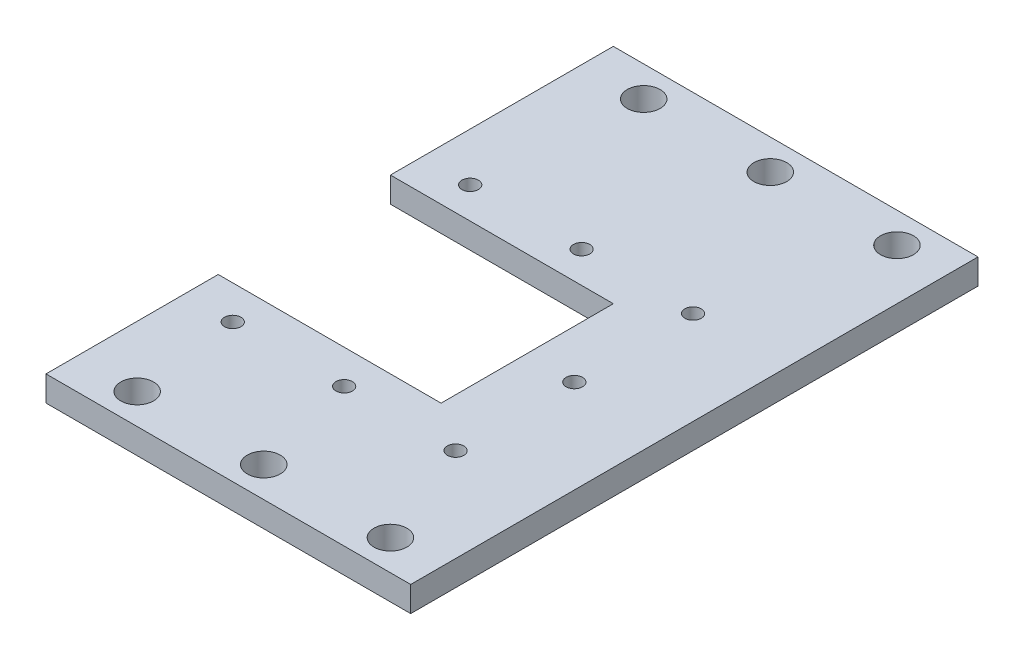
ISO-10303-21;
HEADER;
FILE_DESCRIPTION(('STEP AP214'),'2;1');
FILE_NAME('part.step','',(''),(''),'','','');
FILE_SCHEMA(('AUTOMOTIVE_DESIGN { 1 0 10303 214 1 1 1 1 }'));
ENDSEC;
DATA;
#1=APPLICATION_CONTEXT('core data for automotive mechanical design processes');
#2=APPLICATION_PROTOCOL_DEFINITION('international standard','automotive_design',2000,#1);
#3=PRODUCT_CONTEXT('',#1,'mechanical');
#4=PRODUCT('Part','Part','',(#3));
#5=PRODUCT_RELATED_PRODUCT_CATEGORY('part','',(#4));
#6=PRODUCT_DEFINITION_FORMATION('','',#4);
#7=PRODUCT_DEFINITION_CONTEXT('part definition',#1,'design');
#8=PRODUCT_DEFINITION('design','',#6,#7);
#9=PRODUCT_DEFINITION_SHAPE('','',#8);
#10=(LENGTH_UNIT() NAMED_UNIT(*) SI_UNIT(.MILLI.,.METRE.));
#11=(NAMED_UNIT(*) PLANE_ANGLE_UNIT() SI_UNIT($,.RADIAN.));
#12=(NAMED_UNIT(*) SI_UNIT($,.STERADIAN.) SOLID_ANGLE_UNIT());
#13=UNCERTAINTY_MEASURE_WITH_UNIT(LENGTH_MEASURE(1.E-05),#10,'distance_accuracy_value','');
#14=(GEOMETRIC_REPRESENTATION_CONTEXT(3) GLOBAL_UNCERTAINTY_ASSIGNED_CONTEXT((#13)) GLOBAL_UNIT_ASSIGNED_CONTEXT((#10,
#11,#12)) REPRESENTATION_CONTEXT('',''));
#15=CARTESIAN_POINT('',(0.,0.,0.));
#16=DIRECTION('',(0.,0.,1.));
#17=DIRECTION('',(1.,0.,0.));
#18=AXIS2_PLACEMENT_3D('',#15,#16,#17);
#19=CARTESIAN_POINT('',(-57.15,3.9624,88.9));
#20=DIRECTION('',(1.,0.,0.));
#21=DIRECTION('',(0.,0.,-1.));
#22=AXIS2_PLACEMENT_3D('',#19,#20,#21);
#23=PLANE('',#22);
#24=DIRECTION('',(0.,0.,1.));
#25=VECTOR('',#24,1.);
#26=CARTESIAN_POINT('',(-57.15,-3.9624,88.9));
#27=LINE('',#26,#25);
#28=CARTESIAN_POINT('',(-57.15,-3.9624,-88.9));
#29=VERTEX_POINT('',#28);
#30=CARTESIAN_POINT('',(-57.15,-3.9624,-19.05));
#31=VERTEX_POINT('',#30);
#32=EDGE_CURVE('E132',#29,#31,#27,.T.);
#33=ORIENTED_EDGE('',*,*,#32,.T.);
#34=DIRECTION('',(0.,-1.,0.));
#35=VECTOR('',#34,1.);
#36=CARTESIAN_POINT('',(-57.15,-3.9624,-19.05));
#37=LINE('',#36,#35);
#38=CARTESIAN_POINT('',(-57.15,3.9624,-19.05));
#39=VERTEX_POINT('',#38);
#40=EDGE_CURVE('E117',#39,#31,#37,.T.);
#41=ORIENTED_EDGE('',*,*,#40,.F.);
#42=DIRECTION('',(0.,0.,1.));
#43=VECTOR('',#42,1.);
#44=CARTESIAN_POINT('',(-57.15,3.9624,88.9));
#45=LINE('',#44,#43);
#46=CARTESIAN_POINT('',(-57.15,3.9624,-88.9));
#47=VERTEX_POINT('',#46);
#48=EDGE_CURVE('E224',#47,#39,#45,.T.);
#49=ORIENTED_EDGE('',*,*,#48,.F.);
#50=DIRECTION('',(0.,-1.,0.));
#51=VECTOR('',#50,1.);
#52=CARTESIAN_POINT('',(-57.15,3.9624,-88.9));
#53=LINE('',#52,#51);
#54=EDGE_CURVE('E52',#47,#29,#53,.T.);
#55=ORIENTED_EDGE('',*,*,#54,.T.);
#56=EDGE_LOOP('',(#33,#41,#49,#55));
#57=FACE_BOUND('',#56,.T.);
#58=ADVANCED_FACE('F43',(#57),#23,.F.);
#59=CARTESIAN_POINT('',(57.15,3.9624,88.9));
#60=DIRECTION('',(-1.,0.,0.));
#61=DIRECTION('',(0.,0.,1.));
#62=AXIS2_PLACEMENT_3D('',#59,#60,#61);
#63=PLANE('',#62);
#64=DIRECTION('',(0.,0.,-1.));
#65=VECTOR('',#64,1.);
#66=CARTESIAN_POINT('',(57.15,-3.9624,88.9));
#67=LINE('',#66,#65);
#68=CARTESIAN_POINT('',(57.15,-3.9624,88.9));
#69=VERTEX_POINT('',#68);
#70=CARTESIAN_POINT('',(57.15,-3.9624,-88.9));
#71=VERTEX_POINT('',#70);
#72=EDGE_CURVE('E218',#69,#71,#67,.T.);
#73=ORIENTED_EDGE('',*,*,#72,.T.);
#74=DIRECTION('',(0.,-1.,0.));
#75=VECTOR('',#74,1.);
#76=CARTESIAN_POINT('',(57.15,3.9624,-88.9));
#77=LINE('',#76,#75);
#78=CARTESIAN_POINT('',(57.15,3.9624,-88.9));
#79=VERTEX_POINT('',#78);
#80=EDGE_CURVE('E11',#79,#71,#77,.T.);
#81=ORIENTED_EDGE('',*,*,#80,.F.);
#82=DIRECTION('',(0.,0.,-1.));
#83=VECTOR('',#82,1.);
#84=CARTESIAN_POINT('',(57.15,3.9624,88.9));
#85=LINE('',#84,#83);
#86=CARTESIAN_POINT('',(57.15,3.9624,88.9));
#87=VERTEX_POINT('',#86);
#88=EDGE_CURVE('E141',#87,#79,#85,.T.);
#89=ORIENTED_EDGE('',*,*,#88,.F.);
#90=DIRECTION('',(0.,-1.,0.));
#91=VECTOR('',#90,1.);
#92=CARTESIAN_POINT('',(57.15,3.9624,88.9));
#93=LINE('',#92,#91);
#94=EDGE_CURVE('E147',#87,#69,#93,.T.);
#95=ORIENTED_EDGE('',*,*,#94,.T.);
#96=EDGE_LOOP('',(#73,#81,#89,#95));
#97=FACE_BOUND('',#96,.T.);
#98=ADVANCED_FACE('F45',(#97),#63,.F.);
#99=CARTESIAN_POINT('',(-57.15,3.9624,-88.9));
#100=DIRECTION('',(0.,0.,1.));
#101=DIRECTION('',(1.,0.,0.));
#102=AXIS2_PLACEMENT_3D('',#99,#100,#101);
#103=PLANE('',#102);
#104=DIRECTION('',(-1.,0.,0.));
#105=VECTOR('',#104,1.);
#106=CARTESIAN_POINT('',(-57.15,-3.9624,-88.9));
#107=LINE('',#106,#105);
#108=EDGE_CURVE('E143',#71,#29,#107,.T.);
#109=ORIENTED_EDGE('',*,*,#108,.T.);
#110=ORIENTED_EDGE('',*,*,#54,.F.);
#111=DIRECTION('',(-1.,0.,0.));
#112=VECTOR('',#111,1.);
#113=CARTESIAN_POINT('',(-57.15,3.9624,-88.9));
#114=LINE('',#113,#112);
#115=EDGE_CURVE('E97',#79,#47,#114,.T.);
#116=ORIENTED_EDGE('',*,*,#115,.F.);
#117=ORIENTED_EDGE('',*,*,#80,.T.);
#118=EDGE_LOOP('',(#109,#110,#116,#117));
#119=FACE_BOUND('',#118,.T.);
#120=ADVANCED_FACE('F230',(#119),#103,.F.);
#121=CARTESIAN_POINT('',(-57.15,3.9624,34.925));
#122=VERTEX_POINT('',#121);
#123=CARTESIAN_POINT('',(-57.15,3.9624,88.9));
#124=VERTEX_POINT('',#123);
#125=EDGE_CURVE('E223',#122,#124,#45,.T.);
#126=ORIENTED_EDGE('',*,*,#125,.F.);
#127=DIRECTION('',(0.,1.,0.));
#128=VECTOR('',#127,1.);
#129=CARTESIAN_POINT('',(-57.15,-3.9624,34.925));
#130=LINE('',#129,#128);
#131=CARTESIAN_POINT('',(-57.15,-3.9624,34.925));
#132=VERTEX_POINT('',#131);
#133=EDGE_CURVE('E126',#132,#122,#130,.T.);
#134=ORIENTED_EDGE('',*,*,#133,.F.);
#135=CARTESIAN_POINT('',(-57.15,-3.9624,88.9));
#136=VERTEX_POINT('',#135);
#137=EDGE_CURVE('E139',#132,#136,#27,.T.);
#138=ORIENTED_EDGE('',*,*,#137,.T.);
#139=DIRECTION('',(0.,-1.,0.));
#140=VECTOR('',#139,1.);
#141=CARTESIAN_POINT('',(-57.15,3.9624,88.9));
#142=LINE('',#141,#140);
#143=EDGE_CURVE('E149',#124,#136,#142,.T.);
#144=ORIENTED_EDGE('',*,*,#143,.F.);
#145=EDGE_LOOP('',(#126,#134,#138,#144));
#146=FACE_BOUND('',#145,.T.);
#147=ADVANCED_FACE('F236',(#146),#23,.F.);
#148=CARTESIAN_POINT('',(-57.15,3.9624,88.9));
#149=DIRECTION('',(0.,0.,-1.));
#150=DIRECTION('',(-1.,0.,0.));
#151=AXIS2_PLACEMENT_3D('',#148,#149,#150);
#152=PLANE('',#151);
#153=DIRECTION('',(1.,0.,0.));
#154=VECTOR('',#153,1.);
#155=CARTESIAN_POINT('',(-57.15,-3.9624,88.9));
#156=LINE('',#155,#154);
#157=EDGE_CURVE('E90',#136,#69,#156,.T.);
#158=ORIENTED_EDGE('',*,*,#157,.T.);
#159=ORIENTED_EDGE('',*,*,#94,.F.);
#160=DIRECTION('',(1.,0.,0.));
#161=VECTOR('',#160,1.);
#162=CARTESIAN_POINT('',(-57.15,3.9624,88.9));
#163=LINE('',#162,#161);
#164=EDGE_CURVE('E69',#124,#87,#163,.T.);
#165=ORIENTED_EDGE('',*,*,#164,.F.);
#166=ORIENTED_EDGE('',*,*,#143,.T.);
#167=EDGE_LOOP('',(#158,#159,#165,#166));
#168=FACE_BOUND('',#167,.T.);
#169=ADVANCED_FACE('F237',(#168),#152,.F.);
#170=CARTESIAN_POINT('',(0.,3.9624,0.));
#171=DIRECTION('',(0.,-1.,0.));
#172=DIRECTION('',(0.,0.,-1.));
#173=AXIS2_PLACEMENT_3D('',#170,#171,#172);
#174=PLANE('',#173);
#175=CARTESIAN_POINT('',(27.8638,3.9624,8.33119999999998));
#176=DIRECTION('',(0.,1.,0.));
#177=DIRECTION('',(0.,0.,1.));
#178=AXIS2_PLACEMENT_3D('',#175,#176,#177);
#179=CIRCLE('',#178,2.5781);
#180=CARTESIAN_POINT('',(27.8638,3.9624,10.9093));
#181=VERTEX_POINT('',#180);
#182=EDGE_CURVE('E453',#181,#181,#179,.T.);
#183=ORIENTED_EDGE('',*,*,#182,.F.);
#184=EDGE_LOOP('',(#183));
#185=FACE_BOUND('',#184,.T.);
#186=CARTESIAN_POINT('',(-7.0612,3.9624,45.5422));
#187=DIRECTION('',(0.,1.,0.));
#188=DIRECTION('',(0.,0.,1.));
#189=AXIS2_PLACEMENT_3D('',#186,#187,#188);
#190=CIRCLE('',#189,2.5781);
#191=CARTESIAN_POINT('',(-7.0612,3.9624,48.1203));
#192=VERTEX_POINT('',#191);
#193=EDGE_CURVE('E460',#192,#192,#190,.T.);
#194=ORIENTED_EDGE('',*,*,#193,.F.);
#195=EDGE_LOOP('',(#194));
#196=FACE_BOUND('',#195,.T.);
#197=CARTESIAN_POINT('',(27.8638,3.9624,45.5422));
#198=DIRECTION('',(0.,1.,0.));
#199=DIRECTION('',(0.,0.,1.));
#200=AXIS2_PLACEMENT_3D('',#197,#198,#199);
#201=CIRCLE('',#200,2.5781);
#202=CARTESIAN_POINT('',(27.8638,3.9624,48.1203));
#203=VERTEX_POINT('',#202);
#204=EDGE_CURVE('E463',#203,#203,#201,.T.);
#205=ORIENTED_EDGE('',*,*,#204,.F.);
#206=EDGE_LOOP('',(#205));
#207=FACE_BOUND('',#206,.T.);
#208=CARTESIAN_POINT('',(-41.9862,3.9624,-28.8798));
#209=DIRECTION('',(0.,1.,0.));
#210=DIRECTION('',(0.,0.,1.));
#211=AXIS2_PLACEMENT_3D('',#208,#209,#210);
#212=CIRCLE('',#211,2.5781);
#213=CARTESIAN_POINT('',(-41.9862,3.9624,-26.3017));
#214=VERTEX_POINT('',#213);
#215=EDGE_CURVE('E466',#214,#214,#212,.T.);
#216=ORIENTED_EDGE('',*,*,#215,.F.);
#217=EDGE_LOOP('',(#216));
#218=FACE_BOUND('',#217,.T.);
#219=CARTESIAN_POINT('',(-7.0612,3.9624,-28.8798));
#220=DIRECTION('',(0.,1.,0.));
#221=DIRECTION('',(0.,0.,1.));
#222=AXIS2_PLACEMENT_3D('',#219,#220,#221);
#223=CIRCLE('',#222,2.5781);
#224=CARTESIAN_POINT('',(-7.0612,3.9624,-26.3017));
#225=VERTEX_POINT('',#224);
#226=EDGE_CURVE('E459',#225,#225,#223,.T.);
#227=ORIENTED_EDGE('',*,*,#226,.F.);
#228=EDGE_LOOP('',(#227));
#229=FACE_BOUND('',#228,.T.);
#230=CARTESIAN_POINT('',(27.8638,3.9624,-28.8798));
#231=DIRECTION('',(0.,1.,0.));
#232=DIRECTION('',(0.,0.,1.));
#233=AXIS2_PLACEMENT_3D('',#230,#231,#232);
#234=CIRCLE('',#233,2.5781);
#235=CARTESIAN_POINT('',(27.8638,3.9624,-26.3017));
#236=VERTEX_POINT('',#235);
#237=EDGE_CURVE('E455',#236,#236,#234,.T.);
#238=ORIENTED_EDGE('',*,*,#237,.F.);
#239=EDGE_LOOP('',(#238));
#240=FACE_BOUND('',#239,.T.);
#241=CARTESIAN_POINT('',(-41.9862,3.9624,45.5422));
#242=DIRECTION('',(0.,1.,0.));
#243=DIRECTION('',(0.,0.,1.));
#244=AXIS2_PLACEMENT_3D('',#241,#242,#243);
#245=CIRCLE('',#244,2.5781);
#246=CARTESIAN_POINT('',(-41.9862,3.9624,48.1203));
#247=VERTEX_POINT('',#246);
#248=EDGE_CURVE('E156',#247,#247,#245,.T.);
#249=ORIENTED_EDGE('',*,*,#248,.F.);
#250=EDGE_LOOP('',(#249));
#251=FACE_BOUND('',#250,.T.);
#252=CARTESIAN_POINT('',(41.275,3.9624,79.375));
#253=DIRECTION('',(0.,1.,0.));
#254=DIRECTION('',(0.,0.,1.));
#255=AXIS2_PLACEMENT_3D('',#252,#253,#254);
#256=CIRCLE('',#255,5.1562);
#257=CARTESIAN_POINT('',(41.275,3.9624,84.5312));
#258=VERTEX_POINT('',#257);
#259=EDGE_CURVE('E178',#258,#258,#256,.T.);
#260=ORIENTED_EDGE('',*,*,#259,.F.);
#261=EDGE_LOOP('',(#260));
#262=FACE_BOUND('',#261,.T.);
#263=CARTESIAN_POINT('',(41.275,3.9624,-79.375));
#264=DIRECTION('',(0.,1.,0.));
#265=DIRECTION('',(0.,0.,1.));
#266=AXIS2_PLACEMENT_3D('',#263,#264,#265);
#267=CIRCLE('',#266,5.1562);
#268=CARTESIAN_POINT('',(41.275,3.9624,-74.2188));
#269=VERTEX_POINT('',#268);
#270=EDGE_CURVE('E173',#269,#269,#267,.T.);
#271=ORIENTED_EDGE('',*,*,#270,.F.);
#272=EDGE_LOOP('',(#271));
#273=FACE_BOUND('',#272,.T.);
#274=CARTESIAN_POINT('',(1.5748,3.9624,79.375));
#275=DIRECTION('',(0.,1.,0.));
#276=DIRECTION('',(0.,0.,1.));
#277=AXIS2_PLACEMENT_3D('',#274,#275,#276);
#278=CIRCLE('',#277,5.1562);
#279=CARTESIAN_POINT('',(1.5748,3.9624,84.5312));
#280=VERTEX_POINT('',#279);
#281=EDGE_CURVE('E186',#280,#280,#278,.T.);
#282=ORIENTED_EDGE('',*,*,#281,.F.);
#283=EDGE_LOOP('',(#282));
#284=FACE_BOUND('',#283,.T.);
#285=CARTESIAN_POINT('',(1.5748,3.9624,-79.375));
#286=DIRECTION('',(0.,1.,0.));
#287=DIRECTION('',(0.,0.,1.));
#288=AXIS2_PLACEMENT_3D('',#285,#286,#287);
#289=CIRCLE('',#288,5.1562);
#290=CARTESIAN_POINT('',(1.5748,3.9624,-74.2188));
#291=VERTEX_POINT('',#290);
#292=EDGE_CURVE('E189',#291,#291,#289,.T.);
#293=ORIENTED_EDGE('',*,*,#292,.F.);
#294=EDGE_LOOP('',(#293));
#295=FACE_BOUND('',#294,.T.);
#296=CARTESIAN_POINT('',(-38.1,3.9624,79.375));
#297=DIRECTION('',(0.,1.,0.));
#298=DIRECTION('',(0.,0.,1.));
#299=AXIS2_PLACEMENT_3D('',#296,#297,#298);
#300=CIRCLE('',#299,5.1562);
#301=CARTESIAN_POINT('',(-38.1,3.9624,84.5312));
#302=VERTEX_POINT('',#301);
#303=EDGE_CURVE('E199',#302,#302,#300,.T.);
#304=ORIENTED_EDGE('',*,*,#303,.F.);
#305=EDGE_LOOP('',(#304));
#306=FACE_BOUND('',#305,.T.);
#307=CARTESIAN_POINT('',(-38.1,3.9624,-79.375));
#308=DIRECTION('',(0.,1.,0.));
#309=DIRECTION('',(0.,0.,1.));
#310=AXIS2_PLACEMENT_3D('',#307,#308,#309);
#311=CIRCLE('',#310,5.1562);
#312=CARTESIAN_POINT('',(-38.1,3.9624,-74.2188));
#313=VERTEX_POINT('',#312);
#314=EDGE_CURVE('E202',#313,#313,#311,.T.);
#315=ORIENTED_EDGE('',*,*,#314,.F.);
#316=EDGE_LOOP('',(#315));
#317=FACE_BOUND('',#316,.T.);
#318=ORIENTED_EDGE('',*,*,#48,.T.);
#319=DIRECTION('',(-1.,0.,0.));
#320=VECTOR('',#319,1.);
#321=CARTESIAN_POINT('',(-171.45,3.9624,-19.05));
#322=LINE('',#321,#320);
#323=CARTESIAN_POINT('',(12.7,3.9624,-19.05));
#324=VERTEX_POINT('',#323);
#325=EDGE_CURVE('E120',#324,#39,#322,.T.);
#326=ORIENTED_EDGE('',*,*,#325,.F.);
#327=DIRECTION('',(0.,0.,-1.));
#328=VECTOR('',#327,1.);
#329=CARTESIAN_POINT('',(12.7,3.9624,34.925));
#330=LINE('',#329,#328);
#331=CARTESIAN_POINT('',(12.7,3.9624,34.925));
#332=VERTEX_POINT('',#331);
#333=EDGE_CURVE('E212',#332,#324,#330,.T.);
#334=ORIENTED_EDGE('',*,*,#333,.F.);
#335=DIRECTION('',(1.,0.,0.));
#336=VECTOR('',#335,1.);
#337=CARTESIAN_POINT('',(-171.45,3.9624,34.925));
#338=LINE('',#337,#336);
#339=EDGE_CURVE('E125',#122,#332,#338,.T.);
#340=ORIENTED_EDGE('',*,*,#339,.F.);
#341=ORIENTED_EDGE('',*,*,#125,.T.);
#342=ORIENTED_EDGE('',*,*,#164,.T.);
#343=ORIENTED_EDGE('',*,*,#88,.T.);
#344=ORIENTED_EDGE('',*,*,#115,.T.);
#345=EDGE_LOOP('',(#318,#326,#334,#340,#341,#342,#343,#344));
#346=FACE_BOUND('',#345,.T.);
#347=ADVANCED_FACE('F239',(#185,#196,#207,#218,#229,#240,#251,#262,#273,#284,#295,#306,#317,
#346),#174,.F.);
#348=CARTESIAN_POINT('',(0.,-3.9624,0.));
#349=DIRECTION('',(0.,-1.,0.));
#350=DIRECTION('',(0.,0.,-1.));
#351=AXIS2_PLACEMENT_3D('',#348,#349,#350);
#352=PLANE('',#351);
#353=CARTESIAN_POINT('',(27.8638,-3.96240000000001,8.33119999999998));
#354=DIRECTION('',(0.,-1.,0.));
#355=DIRECTION('',(0.,0.,-1.));
#356=AXIS2_PLACEMENT_3D('',#353,#354,#355);
#357=CIRCLE('',#356,2.5781);
#358=CARTESIAN_POINT('',(27.8638,-3.96240000000001,5.75309999999998));
#359=VERTEX_POINT('',#358);
#360=EDGE_CURVE('E47',#359,#359,#357,.T.);
#361=ORIENTED_EDGE('',*,*,#360,.F.);
#362=EDGE_LOOP('',(#361));
#363=FACE_BOUND('',#362,.T.);
#364=CARTESIAN_POINT('',(-7.0612,-3.96240000000001,45.5422));
#365=DIRECTION('',(0.,-1.,0.));
#366=DIRECTION('',(0.,0.,-1.));
#367=AXIS2_PLACEMENT_3D('',#364,#365,#366);
#368=CIRCLE('',#367,2.5781);
#369=CARTESIAN_POINT('',(-7.0612,-3.96240000000001,42.9641));
#370=VERTEX_POINT('',#369);
#371=EDGE_CURVE('E167',#370,#370,#368,.T.);
#372=ORIENTED_EDGE('',*,*,#371,.F.);
#373=EDGE_LOOP('',(#372));
#374=FACE_BOUND('',#373,.T.);
#375=CARTESIAN_POINT('',(27.8638,-3.96240000000001,45.5422));
#376=DIRECTION('',(0.,-1.,0.));
#377=DIRECTION('',(0.,0.,-1.));
#378=AXIS2_PLACEMENT_3D('',#375,#376,#377);
#379=CIRCLE('',#378,2.5781);
#380=CARTESIAN_POINT('',(27.8638,-3.96240000000001,42.9641));
#381=VERTEX_POINT('',#380);
#382=EDGE_CURVE('E165',#381,#381,#379,.T.);
#383=ORIENTED_EDGE('',*,*,#382,.F.);
#384=EDGE_LOOP('',(#383));
#385=FACE_BOUND('',#384,.T.);
#386=CARTESIAN_POINT('',(-41.9862,-3.96240000000001,-28.8798));
#387=DIRECTION('',(0.,-1.,0.));
#388=DIRECTION('',(0.,0.,-1.));
#389=AXIS2_PLACEMENT_3D('',#386,#387,#388);
#390=CIRCLE('',#389,2.5781);
#391=CARTESIAN_POINT('',(-41.9862,-3.96240000000001,-31.4579));
#392=VERTEX_POINT('',#391);
#393=EDGE_CURVE('E162',#392,#392,#390,.T.);
#394=ORIENTED_EDGE('',*,*,#393,.F.);
#395=EDGE_LOOP('',(#394));
#396=FACE_BOUND('',#395,.T.);
#397=CARTESIAN_POINT('',(-7.0612,-3.96240000000001,-28.8798));
#398=DIRECTION('',(0.,-1.,0.));
#399=DIRECTION('',(0.,0.,-1.));
#400=AXIS2_PLACEMENT_3D('',#397,#398,#399);
#401=CIRCLE('',#400,2.5781);
#402=CARTESIAN_POINT('',(-7.0612,-3.96240000000001,-31.4579));
#403=VERTEX_POINT('',#402);
#404=EDGE_CURVE('E159',#403,#403,#401,.T.);
#405=ORIENTED_EDGE('',*,*,#404,.F.);
#406=EDGE_LOOP('',(#405));
#407=FACE_BOUND('',#406,.T.);
#408=CARTESIAN_POINT('',(27.8638,-3.96240000000001,-28.8798));
#409=DIRECTION('',(0.,-1.,0.));
#410=DIRECTION('',(0.,0.,-1.));
#411=AXIS2_PLACEMENT_3D('',#408,#409,#410);
#412=CIRCLE('',#411,2.5781);
#413=CARTESIAN_POINT('',(27.8638,-3.96240000000001,-31.4579));
#414=VERTEX_POINT('',#413);
#415=EDGE_CURVE('E155',#414,#414,#412,.T.);
#416=ORIENTED_EDGE('',*,*,#415,.F.);
#417=EDGE_LOOP('',(#416));
#418=FACE_BOUND('',#417,.T.);
#419=CARTESIAN_POINT('',(-41.9862,-3.96240000000001,45.5422));
#420=DIRECTION('',(0.,-1.,0.));
#421=DIRECTION('',(0.,0.,-1.));
#422=AXIS2_PLACEMENT_3D('',#419,#420,#421);
#423=CIRCLE('',#422,2.5781);
#424=CARTESIAN_POINT('',(-41.9862,-3.96240000000001,42.9641));
#425=VERTEX_POINT('',#424);
#426=EDGE_CURVE('E152',#425,#425,#423,.T.);
#427=ORIENTED_EDGE('',*,*,#426,.F.);
#428=EDGE_LOOP('',(#427));
#429=FACE_BOUND('',#428,.T.);
#430=CARTESIAN_POINT('',(41.275,-3.9624,79.375));
#431=DIRECTION('',(0.,1.,0.));
#432=DIRECTION('',(0.,0.,1.));
#433=AXIS2_PLACEMENT_3D('',#430,#431,#432);
#434=CIRCLE('',#433,5.1562);
#435=CARTESIAN_POINT('',(41.275,-3.9624,84.5312));
#436=VERTEX_POINT('',#435);
#437=EDGE_CURVE('E195',#436,#436,#434,.T.);
#438=ORIENTED_EDGE('',*,*,#437,.T.);
#439=EDGE_LOOP('',(#438));
#440=FACE_BOUND('',#439,.T.);
#441=CARTESIAN_POINT('',(41.275,-3.9624,-79.375));
#442=DIRECTION('',(0.,1.,0.));
#443=DIRECTION('',(0.,0.,1.));
#444=AXIS2_PLACEMENT_3D('',#441,#442,#443);
#445=CIRCLE('',#444,5.1562);
#446=CARTESIAN_POINT('',(41.275,-3.9624,-74.2188));
#447=VERTEX_POINT('',#446);
#448=EDGE_CURVE('E169',#447,#447,#445,.T.);
#449=ORIENTED_EDGE('',*,*,#448,.T.);
#450=EDGE_LOOP('',(#449));
#451=FACE_BOUND('',#450,.T.);
#452=CARTESIAN_POINT('',(1.5748,-3.9624,79.375));
#453=DIRECTION('',(0.,1.,0.));
#454=DIRECTION('',(0.,0.,1.));
#455=AXIS2_PLACEMENT_3D('',#452,#453,#454);
#456=CIRCLE('',#455,5.1562);
#457=CARTESIAN_POINT('',(1.5748,-3.9624,84.5312));
#458=VERTEX_POINT('',#457);
#459=EDGE_CURVE('E182',#458,#458,#456,.T.);
#460=ORIENTED_EDGE('',*,*,#459,.T.);
#461=EDGE_LOOP('',(#460));
#462=FACE_BOUND('',#461,.T.);
#463=CARTESIAN_POINT('',(1.5748,-3.9624,-79.375));
#464=DIRECTION('',(0.,1.,0.));
#465=DIRECTION('',(0.,0.,1.));
#466=AXIS2_PLACEMENT_3D('',#463,#464,#465);
#467=CIRCLE('',#466,5.1562);
#468=CARTESIAN_POINT('',(1.5748,-3.9624,-74.2188));
#469=VERTEX_POINT('',#468);
#470=EDGE_CURVE('E192',#469,#469,#467,.T.);
#471=ORIENTED_EDGE('',*,*,#470,.T.);
#472=EDGE_LOOP('',(#471));
#473=FACE_BOUND('',#472,.T.);
#474=CARTESIAN_POINT('',(-38.1,-3.9624,79.375));
#475=DIRECTION('',(0.,1.,0.));
#476=DIRECTION('',(0.,0.,1.));
#477=AXIS2_PLACEMENT_3D('',#474,#475,#476);
#478=CIRCLE('',#477,5.1562);
#479=CARTESIAN_POINT('',(-38.1,-3.9624,84.5312));
#480=VERTEX_POINT('',#479);
#481=EDGE_CURVE('E196',#480,#480,#478,.T.);
#482=ORIENTED_EDGE('',*,*,#481,.T.);
#483=EDGE_LOOP('',(#482));
#484=FACE_BOUND('',#483,.T.);
#485=CARTESIAN_POINT('',(-38.1,-3.9624,-79.375));
#486=DIRECTION('',(0.,1.,0.));
#487=DIRECTION('',(0.,0.,1.));
#488=AXIS2_PLACEMENT_3D('',#485,#486,#487);
#489=CIRCLE('',#488,5.1562);
#490=CARTESIAN_POINT('',(-38.1,-3.9624,-74.2188));
#491=VERTEX_POINT('',#490);
#492=EDGE_CURVE('E185',#491,#491,#489,.T.);
#493=ORIENTED_EDGE('',*,*,#492,.T.);
#494=EDGE_LOOP('',(#493));
#495=FACE_BOUND('',#494,.T.);
#496=DIRECTION('',(-1.,0.,0.));
#497=VECTOR('',#496,1.);
#498=CARTESIAN_POINT('',(-171.45,-3.9624,-19.05));
#499=LINE('',#498,#497);
#500=CARTESIAN_POINT('',(12.7,-3.9624,-19.05));
#501=VERTEX_POINT('',#500);
#502=EDGE_CURVE('E60',#501,#31,#499,.T.);
#503=ORIENTED_EDGE('',*,*,#502,.T.);
#504=ORIENTED_EDGE('',*,*,#32,.F.);
#505=ORIENTED_EDGE('',*,*,#108,.F.);
#506=ORIENTED_EDGE('',*,*,#72,.F.);
#507=ORIENTED_EDGE('',*,*,#157,.F.);
#508=ORIENTED_EDGE('',*,*,#137,.F.);
#509=DIRECTION('',(1.,0.,0.));
#510=VECTOR('',#509,1.);
#511=CARTESIAN_POINT('',(-171.45,-3.9624,34.925));
#512=LINE('',#511,#510);
#513=CARTESIAN_POINT('',(12.7,-3.9624,34.925));
#514=VERTEX_POINT('',#513);
#515=EDGE_CURVE('E208',#132,#514,#512,.T.);
#516=ORIENTED_EDGE('',*,*,#515,.T.);
#517=DIRECTION('',(0.,0.,-1.));
#518=VECTOR('',#517,1.);
#519=CARTESIAN_POINT('',(12.7,-3.9624,34.925));
#520=LINE('',#519,#518);
#521=EDGE_CURVE('E135',#514,#501,#520,.T.);
#522=ORIENTED_EDGE('',*,*,#521,.T.);
#523=EDGE_LOOP('',(#503,#504,#505,#506,#507,#508,#516,#522));
#524=FACE_BOUND('',#523,.T.);
#525=ADVANCED_FACE('F131',(#363,#374,#385,#396,#407,#418,#429,#440,#451,#462,#473,#484,#495,
#524),#352,.T.);
#526=CARTESIAN_POINT('',(-171.45,-3.9624,-19.05));
#527=DIRECTION('',(0.,0.,-1.));
#528=DIRECTION('',(-1.,0.,0.));
#529=AXIS2_PLACEMENT_3D('',#526,#527,#528);
#530=PLANE('',#529);
#531=ORIENTED_EDGE('',*,*,#40,.T.);
#532=ORIENTED_EDGE('',*,*,#502,.F.);
#533=DIRECTION('',(0.,1.,0.));
#534=VECTOR('',#533,1.);
#535=CARTESIAN_POINT('',(12.7,-3.9624,-19.05));
#536=LINE('',#535,#534);
#537=EDGE_CURVE('E216',#501,#324,#536,.T.);
#538=ORIENTED_EDGE('',*,*,#537,.T.);
#539=ORIENTED_EDGE('',*,*,#325,.T.);
#540=EDGE_LOOP('',(#531,#532,#538,#539));
#541=FACE_BOUND('',#540,.T.);
#542=ADVANCED_FACE('F118',(#541),#530,.F.);
#543=CARTESIAN_POINT('',(-171.45,-3.9624,34.925));
#544=DIRECTION('',(0.,0.,1.));
#545=DIRECTION('',(1.,0.,0.));
#546=AXIS2_PLACEMENT_3D('',#543,#544,#545);
#547=PLANE('',#546);
#548=ORIENTED_EDGE('',*,*,#133,.T.);
#549=ORIENTED_EDGE('',*,*,#339,.T.);
#550=DIRECTION('',(0.,1.,0.));
#551=VECTOR('',#550,1.);
#552=CARTESIAN_POINT('',(12.7,-3.9624,34.925));
#553=LINE('',#552,#551);
#554=EDGE_CURVE('E136',#514,#332,#553,.T.);
#555=ORIENTED_EDGE('',*,*,#554,.F.);
#556=ORIENTED_EDGE('',*,*,#515,.F.);
#557=EDGE_LOOP('',(#548,#549,#555,#556));
#558=FACE_BOUND('',#557,.T.);
#559=ADVANCED_FACE('F245',(#558),#547,.F.);
#560=CARTESIAN_POINT('',(12.7,-3.9624,34.925));
#561=DIRECTION('',(1.,0.,0.));
#562=DIRECTION('',(0.,0.,-1.));
#563=AXIS2_PLACEMENT_3D('',#560,#561,#562);
#564=PLANE('',#563);
#565=ORIENTED_EDGE('',*,*,#333,.T.);
#566=ORIENTED_EDGE('',*,*,#537,.F.);
#567=ORIENTED_EDGE('',*,*,#521,.F.);
#568=ORIENTED_EDGE('',*,*,#554,.T.);
#569=EDGE_LOOP('',(#565,#566,#567,#568));
#570=FACE_BOUND('',#569,.T.);
#571=ADVANCED_FACE('F243',(#570),#564,.F.);
#572=CARTESIAN_POINT('',(-38.1,-3.9624,-79.375));
#573=DIRECTION('',(0.,1.,0.));
#574=DIRECTION('',(0.,0.,1.));
#575=AXIS2_PLACEMENT_3D('',#572,#573,#574);
#576=CYLINDRICAL_SURFACE('',#575,5.1562);
#577=ORIENTED_EDGE('',*,*,#492,.F.);
#578=EDGE_LOOP('',(#577));
#579=FACE_BOUND('',#578,.T.);
#580=ORIENTED_EDGE('',*,*,#314,.T.);
#581=EDGE_LOOP('',(#580));
#582=FACE_BOUND('',#581,.T.);
#583=ADVANCED_FACE('F252',(#579,#582),#576,.F.);
#584=CARTESIAN_POINT('',(-38.1,-3.9624,79.375));
#585=DIRECTION('',(0.,1.,0.));
#586=DIRECTION('',(0.,0.,1.));
#587=AXIS2_PLACEMENT_3D('',#584,#585,#586);
#588=CYLINDRICAL_SURFACE('',#587,5.1562);
#589=ORIENTED_EDGE('',*,*,#481,.F.);
#590=EDGE_LOOP('',(#589));
#591=FACE_BOUND('',#590,.T.);
#592=ORIENTED_EDGE('',*,*,#303,.T.);
#593=EDGE_LOOP('',(#592));
#594=FACE_BOUND('',#593,.T.);
#595=ADVANCED_FACE('F328',(#591,#594),#588,.F.);
#596=CARTESIAN_POINT('',(1.5748,-3.9624,-79.375));
#597=DIRECTION('',(0.,1.,0.));
#598=DIRECTION('',(0.,0.,1.));
#599=AXIS2_PLACEMENT_3D('',#596,#597,#598);
#600=CYLINDRICAL_SURFACE('',#599,5.1562);
#601=ORIENTED_EDGE('',*,*,#470,.F.);
#602=EDGE_LOOP('',(#601));
#603=FACE_BOUND('',#602,.T.);
#604=ORIENTED_EDGE('',*,*,#292,.T.);
#605=EDGE_LOOP('',(#604));
#606=FACE_BOUND('',#605,.T.);
#607=ADVANCED_FACE('F338',(#603,#606),#600,.F.);
#608=CARTESIAN_POINT('',(1.5748,-3.9624,79.375));
#609=DIRECTION('',(0.,1.,0.));
#610=DIRECTION('',(0.,0.,1.));
#611=AXIS2_PLACEMENT_3D('',#608,#609,#610);
#612=CYLINDRICAL_SURFACE('',#611,5.1562);
#613=ORIENTED_EDGE('',*,*,#459,.F.);
#614=EDGE_LOOP('',(#613));
#615=FACE_BOUND('',#614,.T.);
#616=ORIENTED_EDGE('',*,*,#281,.T.);
#617=EDGE_LOOP('',(#616));
#618=FACE_BOUND('',#617,.T.);
#619=ADVANCED_FACE('F348',(#615,#618),#612,.F.);
#620=CARTESIAN_POINT('',(41.275,-3.9624,-79.375));
#621=DIRECTION('',(0.,1.,0.));
#622=DIRECTION('',(0.,0.,1.));
#623=AXIS2_PLACEMENT_3D('',#620,#621,#622);
#624=CYLINDRICAL_SURFACE('',#623,5.1562);
#625=ORIENTED_EDGE('',*,*,#448,.F.);
#626=EDGE_LOOP('',(#625));
#627=FACE_BOUND('',#626,.T.);
#628=ORIENTED_EDGE('',*,*,#270,.T.);
#629=EDGE_LOOP('',(#628));
#630=FACE_BOUND('',#629,.T.);
#631=ADVANCED_FACE('F358',(#627,#630),#624,.F.);
#632=CARTESIAN_POINT('',(41.275,-3.9624,79.375));
#633=DIRECTION('',(0.,1.,0.));
#634=DIRECTION('',(0.,0.,1.));
#635=AXIS2_PLACEMENT_3D('',#632,#633,#634);
#636=CYLINDRICAL_SURFACE('',#635,5.1562);
#637=ORIENTED_EDGE('',*,*,#437,.F.);
#638=EDGE_LOOP('',(#637));
#639=FACE_BOUND('',#638,.T.);
#640=ORIENTED_EDGE('',*,*,#259,.T.);
#641=EDGE_LOOP('',(#640));
#642=FACE_BOUND('',#641,.T.);
#643=ADVANCED_FACE('F368',(#639,#642),#636,.F.);
#644=CARTESIAN_POINT('',(-41.9862,-110.3376,45.5422));
#645=DIRECTION('',(0.,1.,0.));
#646=DIRECTION('',(0.,0.,1.));
#647=AXIS2_PLACEMENT_3D('',#644,#645,#646);
#648=CYLINDRICAL_SURFACE('',#647,2.5781);
#649=ORIENTED_EDGE('',*,*,#426,.T.);
#650=EDGE_LOOP('',(#649));
#651=FACE_BOUND('',#650,.T.);
#652=ORIENTED_EDGE('',*,*,#248,.T.);
#653=EDGE_LOOP('',(#652));
#654=FACE_BOUND('',#653,.T.);
#655=ADVANCED_FACE('F378',(#651,#654),#648,.F.);
#656=CARTESIAN_POINT('',(27.8638,-110.3376,-28.8798));
#657=DIRECTION('',(0.,1.,0.));
#658=DIRECTION('',(0.,0.,1.));
#659=AXIS2_PLACEMENT_3D('',#656,#657,#658);
#660=CYLINDRICAL_SURFACE('',#659,2.5781);
#661=ORIENTED_EDGE('',*,*,#415,.T.);
#662=EDGE_LOOP('',(#661));
#663=FACE_BOUND('',#662,.T.);
#664=ORIENTED_EDGE('',*,*,#237,.T.);
#665=EDGE_LOOP('',(#664));
#666=FACE_BOUND('',#665,.T.);
#667=ADVANCED_FACE('F388',(#663,#666),#660,.F.);
#668=CARTESIAN_POINT('',(-7.0612,-110.3376,-28.8798));
#669=DIRECTION('',(0.,1.,0.));
#670=DIRECTION('',(0.,0.,1.));
#671=AXIS2_PLACEMENT_3D('',#668,#669,#670);
#672=CYLINDRICAL_SURFACE('',#671,2.5781);
#673=ORIENTED_EDGE('',*,*,#404,.T.);
#674=EDGE_LOOP('',(#673));
#675=FACE_BOUND('',#674,.T.);
#676=ORIENTED_EDGE('',*,*,#226,.T.);
#677=EDGE_LOOP('',(#676));
#678=FACE_BOUND('',#677,.T.);
#679=ADVANCED_FACE('F398',(#675,#678),#672,.F.);
#680=CARTESIAN_POINT('',(-41.9862,-110.3376,-28.8798));
#681=DIRECTION('',(0.,1.,0.));
#682=DIRECTION('',(0.,0.,1.));
#683=AXIS2_PLACEMENT_3D('',#680,#681,#682);
#684=CYLINDRICAL_SURFACE('',#683,2.5781);
#685=ORIENTED_EDGE('',*,*,#393,.T.);
#686=EDGE_LOOP('',(#685));
#687=FACE_BOUND('',#686,.T.);
#688=ORIENTED_EDGE('',*,*,#215,.T.);
#689=EDGE_LOOP('',(#688));
#690=FACE_BOUND('',#689,.T.);
#691=ADVANCED_FACE('F408',(#687,#690),#684,.F.);
#692=CARTESIAN_POINT('',(27.8638,-110.3376,45.5422));
#693=DIRECTION('',(0.,1.,0.));
#694=DIRECTION('',(0.,0.,1.));
#695=AXIS2_PLACEMENT_3D('',#692,#693,#694);
#696=CYLINDRICAL_SURFACE('',#695,2.5781);
#697=ORIENTED_EDGE('',*,*,#382,.T.);
#698=EDGE_LOOP('',(#697));
#699=FACE_BOUND('',#698,.T.);
#700=ORIENTED_EDGE('',*,*,#204,.T.);
#701=EDGE_LOOP('',(#700));
#702=FACE_BOUND('',#701,.T.);
#703=ADVANCED_FACE('F418',(#699,#702),#696,.F.);
#704=CARTESIAN_POINT('',(-7.0612,-110.3376,45.5422));
#705=DIRECTION('',(0.,1.,0.));
#706=DIRECTION('',(0.,0.,1.));
#707=AXIS2_PLACEMENT_3D('',#704,#705,#706);
#708=CYLINDRICAL_SURFACE('',#707,2.5781);
#709=ORIENTED_EDGE('',*,*,#371,.T.);
#710=EDGE_LOOP('',(#709));
#711=FACE_BOUND('',#710,.T.);
#712=ORIENTED_EDGE('',*,*,#193,.T.);
#713=EDGE_LOOP('',(#712));
#714=FACE_BOUND('',#713,.T.);
#715=ADVANCED_FACE('F428',(#711,#714),#708,.F.);
#716=CARTESIAN_POINT('',(27.8638,-110.3376,8.33119999999998));
#717=DIRECTION('',(0.,1.,0.));
#718=DIRECTION('',(0.,0.,1.));
#719=AXIS2_PLACEMENT_3D('',#716,#717,#718);
#720=CYLINDRICAL_SURFACE('',#719,2.5781);
#721=ORIENTED_EDGE('',*,*,#360,.T.);
#722=EDGE_LOOP('',(#721));
#723=FACE_BOUND('',#722,.T.);
#724=ORIENTED_EDGE('',*,*,#182,.T.);
#725=EDGE_LOOP('',(#724));
#726=FACE_BOUND('',#725,.T.);
#727=ADVANCED_FACE('F437',(#723,#726),#720,.F.);
#728=CLOSED_SHELL('',(#58,#98,#120,#147,#169,#347,#525,#542,#559,#571,#583,#595,#607,#619,#631,
#643,#655,#667,#679,#691,#703,#715,#727));
#729=MANIFOLD_SOLID_BREP('B2',#728);
#730=ADVANCED_BREP_SHAPE_REPRESENTATION('',(#18,#729),#14);
#731=SHAPE_DEFINITION_REPRESENTATION(#9,#730);
ENDSEC;
END-ISO-10303-21;
